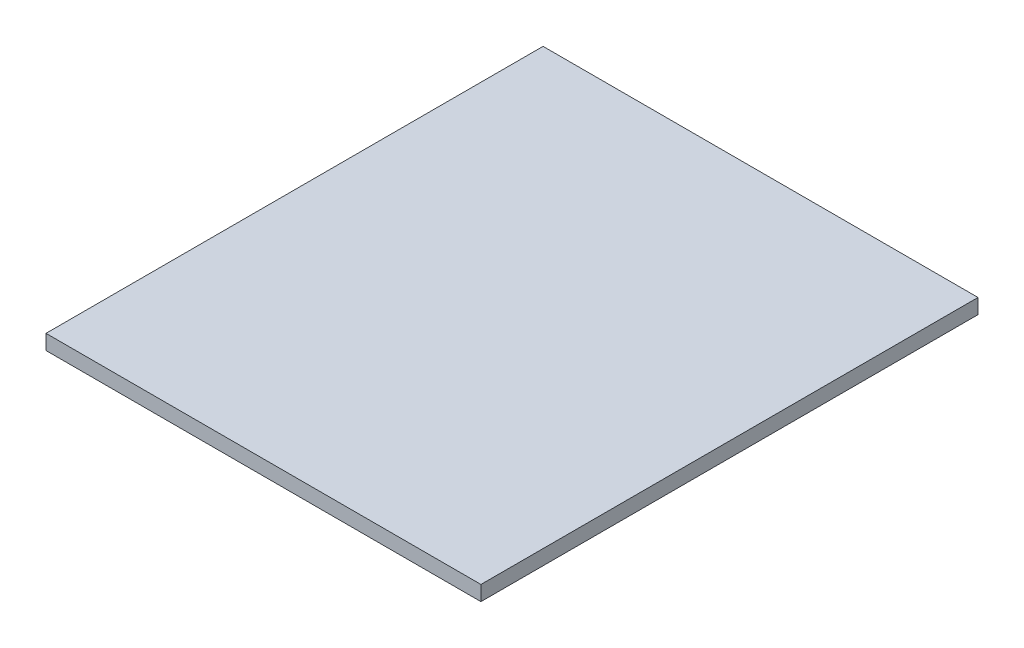
ISO-10303-21;
HEADER;
FILE_DESCRIPTION(('STEP AP214'),'2;1');
FILE_NAME('part.step','',(''),(''),'','','');
FILE_SCHEMA(('AUTOMOTIVE_DESIGN { 1 0 10303 214 1 1 1 1 }'));
ENDSEC;
DATA;
#1=APPLICATION_CONTEXT('core data for automotive mechanical design processes');
#2=APPLICATION_PROTOCOL_DEFINITION('international standard','automotive_design',2000,#1);
#3=PRODUCT_CONTEXT('',#1,'mechanical');
#4=PRODUCT('Part','Part','',(#3));
#5=PRODUCT_RELATED_PRODUCT_CATEGORY('part','',(#4));
#6=PRODUCT_DEFINITION_FORMATION('','',#4);
#7=PRODUCT_DEFINITION_CONTEXT('part definition',#1,'design');
#8=PRODUCT_DEFINITION('design','',#6,#7);
#9=PRODUCT_DEFINITION_SHAPE('','',#8);
#10=(LENGTH_UNIT() NAMED_UNIT(*) SI_UNIT(.MILLI.,.METRE.));
#11=(NAMED_UNIT(*) PLANE_ANGLE_UNIT() SI_UNIT($,.RADIAN.));
#12=(NAMED_UNIT(*) SI_UNIT($,.STERADIAN.) SOLID_ANGLE_UNIT());
#13=UNCERTAINTY_MEASURE_WITH_UNIT(LENGTH_MEASURE(1.E-05),#10,'distance_accuracy_value','');
#14=(GEOMETRIC_REPRESENTATION_CONTEXT(3) GLOBAL_UNCERTAINTY_ASSIGNED_CONTEXT((#13)) GLOBAL_UNIT_ASSIGNED_CONTEXT((#10,
#11,#12)) REPRESENTATION_CONTEXT('',''));
#15=CARTESIAN_POINT('',(0.,0.,0.));
#16=DIRECTION('',(0.,0.,1.));
#17=DIRECTION('',(1.,0.,0.));
#18=AXIS2_PLACEMENT_3D('',#15,#16,#17);
#19=CARTESIAN_POINT('',(0.,12.,0.));
#20=DIRECTION('',(1.,0.,0.));
#21=DIRECTION('',(0.,0.,-1.));
#22=AXIS2_PLACEMENT_3D('',#19,#20,#21);
#23=PLANE('',#22);
#24=DIRECTION('',(0.,0.,1.));
#25=VECTOR('',#24,1.);
#26=CARTESIAN_POINT('',(0.,0.,0.));
#27=LINE('',#26,#25);
#28=CARTESIAN_POINT('',(0.,0.,-400.));
#29=VERTEX_POINT('',#28);
#30=CARTESIAN_POINT('',(0.,0.,0.));
#31=VERTEX_POINT('',#30);
#32=EDGE_CURVE('E104',#29,#31,#27,.T.);
#33=ORIENTED_EDGE('',*,*,#32,.T.);
#34=DIRECTION('',(0.,-1.,0.));
#35=VECTOR('',#34,1.);
#36=CARTESIAN_POINT('',(0.,12.,0.));
#37=LINE('',#36,#35);
#38=CARTESIAN_POINT('',(0.,12.,0.));
#39=VERTEX_POINT('',#38);
#40=EDGE_CURVE('E11',#39,#31,#37,.T.);
#41=ORIENTED_EDGE('',*,*,#40,.F.);
#42=DIRECTION('',(0.,0.,1.));
#43=VECTOR('',#42,1.);
#44=CARTESIAN_POINT('',(0.,12.,0.));
#45=LINE('',#44,#43);
#46=CARTESIAN_POINT('',(0.,12.,-400.));
#47=VERTEX_POINT('',#46);
#48=EDGE_CURVE('E92',#47,#39,#45,.T.);
#49=ORIENTED_EDGE('',*,*,#48,.F.);
#50=DIRECTION('',(0.,-1.,0.));
#51=VECTOR('',#50,1.);
#52=CARTESIAN_POINT('',(0.,12.,-400.));
#53=LINE('',#52,#51);
#54=EDGE_CURVE('E100',#47,#29,#53,.T.);
#55=ORIENTED_EDGE('',*,*,#54,.T.);
#56=EDGE_LOOP('',(#33,#41,#49,#55));
#57=FACE_BOUND('',#56,.T.);
#58=ADVANCED_FACE('F41',(#57),#23,.F.);
#59=CARTESIAN_POINT('',(0.,12.,0.));
#60=DIRECTION('',(0.,0.,-1.));
#61=DIRECTION('',(-1.,0.,0.));
#62=AXIS2_PLACEMENT_3D('',#59,#60,#61);
#63=PLANE('',#62);
#64=DIRECTION('',(1.,0.,0.));
#65=VECTOR('',#64,1.);
#66=CARTESIAN_POINT('',(0.,0.,0.));
#67=LINE('',#66,#65);
#68=CARTESIAN_POINT('',(350.,0.,0.));
#69=VERTEX_POINT('',#68);
#70=EDGE_CURVE('E96',#31,#69,#67,.T.);
#71=ORIENTED_EDGE('',*,*,#70,.T.);
#72=DIRECTION('',(0.,-1.,0.));
#73=VECTOR('',#72,1.);
#74=CARTESIAN_POINT('',(350.,12.,0.));
#75=LINE('',#74,#73);
#76=CARTESIAN_POINT('',(350.,12.,0.));
#77=VERTEX_POINT('',#76);
#78=EDGE_CURVE('E49',#77,#69,#75,.T.);
#79=ORIENTED_EDGE('',*,*,#78,.F.);
#80=DIRECTION('',(1.,0.,0.));
#81=VECTOR('',#80,1.);
#82=CARTESIAN_POINT('',(0.,12.,0.));
#83=LINE('',#82,#81);
#84=EDGE_CURVE('E87',#39,#77,#83,.T.);
#85=ORIENTED_EDGE('',*,*,#84,.F.);
#86=ORIENTED_EDGE('',*,*,#40,.T.);
#87=EDGE_LOOP('',(#71,#79,#85,#86));
#88=FACE_BOUND('',#87,.T.);
#89=ADVANCED_FACE('F95',(#88),#63,.F.);
#90=CARTESIAN_POINT('',(350.,12.,0.));
#91=DIRECTION('',(-1.,0.,0.));
#92=DIRECTION('',(0.,0.,1.));
#93=AXIS2_PLACEMENT_3D('',#90,#91,#92);
#94=PLANE('',#93);
#95=DIRECTION('',(0.,0.,-1.));
#96=VECTOR('',#95,1.);
#97=CARTESIAN_POINT('',(350.,0.,0.));
#98=LINE('',#97,#96);
#99=CARTESIAN_POINT('',(350.,0.,-400.));
#100=VERTEX_POINT('',#99);
#101=EDGE_CURVE('E74',#69,#100,#98,.T.);
#102=ORIENTED_EDGE('',*,*,#101,.T.);
#103=DIRECTION('',(0.,-1.,0.));
#104=VECTOR('',#103,1.);
#105=CARTESIAN_POINT('',(350.,12.,-400.));
#106=LINE('',#105,#104);
#107=CARTESIAN_POINT('',(350.,12.,-400.));
#108=VERTEX_POINT('',#107);
#109=EDGE_CURVE('E97',#108,#100,#106,.T.);
#110=ORIENTED_EDGE('',*,*,#109,.F.);
#111=DIRECTION('',(0.,0.,-1.));
#112=VECTOR('',#111,1.);
#113=CARTESIAN_POINT('',(350.,12.,0.));
#114=LINE('',#113,#112);
#115=EDGE_CURVE('E90',#77,#108,#114,.T.);
#116=ORIENTED_EDGE('',*,*,#115,.F.);
#117=ORIENTED_EDGE('',*,*,#78,.T.);
#118=EDGE_LOOP('',(#102,#110,#116,#117));
#119=FACE_BOUND('',#118,.T.);
#120=ADVANCED_FACE('F98',(#119),#94,.F.);
#121=CARTESIAN_POINT('',(0.,12.,-400.));
#122=DIRECTION('',(0.,0.,1.));
#123=DIRECTION('',(1.,0.,0.));
#124=AXIS2_PLACEMENT_3D('',#121,#122,#123);
#125=PLANE('',#124);
#126=DIRECTION('',(-1.,0.,0.));
#127=VECTOR('',#126,1.);
#128=CARTESIAN_POINT('',(0.,0.,-400.));
#129=LINE('',#128,#127);
#130=EDGE_CURVE('E80',#100,#29,#129,.T.);
#131=ORIENTED_EDGE('',*,*,#130,.T.);
#132=ORIENTED_EDGE('',*,*,#54,.F.);
#133=DIRECTION('',(-1.,0.,0.));
#134=VECTOR('',#133,1.);
#135=CARTESIAN_POINT('',(0.,12.,-400.));
#136=LINE('',#135,#134);
#137=EDGE_CURVE('E57',#108,#47,#136,.T.);
#138=ORIENTED_EDGE('',*,*,#137,.F.);
#139=ORIENTED_EDGE('',*,*,#109,.T.);
#140=EDGE_LOOP('',(#131,#132,#138,#139));
#141=FACE_BOUND('',#140,.T.);
#142=ADVANCED_FACE('F111',(#141),#125,.F.);
#143=CARTESIAN_POINT('',(0.,12.,0.));
#144=DIRECTION('',(0.,-1.,0.));
#145=DIRECTION('',(0.,0.,-1.));
#146=AXIS2_PLACEMENT_3D('',#143,#144,#145);
#147=PLANE('',#146);
#148=ORIENTED_EDGE('',*,*,#48,.T.);
#149=ORIENTED_EDGE('',*,*,#84,.T.);
#150=ORIENTED_EDGE('',*,*,#115,.T.);
#151=ORIENTED_EDGE('',*,*,#137,.T.);
#152=EDGE_LOOP('',(#148,#149,#150,#151));
#153=FACE_BOUND('',#152,.T.);
#154=ADVANCED_FACE('F88',(#153),#147,.F.);
#155=CARTESIAN_POINT('',(0.,0.,0.));
#156=DIRECTION('',(0.,-1.,0.));
#157=DIRECTION('',(0.,0.,-1.));
#158=AXIS2_PLACEMENT_3D('',#155,#156,#157);
#159=PLANE('',#158);
#160=ORIENTED_EDGE('',*,*,#32,.F.);
#161=ORIENTED_EDGE('',*,*,#130,.F.);
#162=ORIENTED_EDGE('',*,*,#101,.F.);
#163=ORIENTED_EDGE('',*,*,#70,.F.);
#164=EDGE_LOOP('',(#160,#161,#162,#163));
#165=FACE_BOUND('',#164,.T.);
#166=ADVANCED_FACE('F114',(#165),#159,.T.);
#167=CLOSED_SHELL('',(#58,#89,#120,#142,#154,#166));
#168=MANIFOLD_SOLID_BREP('B2',#167);
#169=ADVANCED_BREP_SHAPE_REPRESENTATION('',(#18,#168),#14);
#170=SHAPE_DEFINITION_REPRESENTATION(#9,#169);
ENDSEC;
END-ISO-10303-21;
